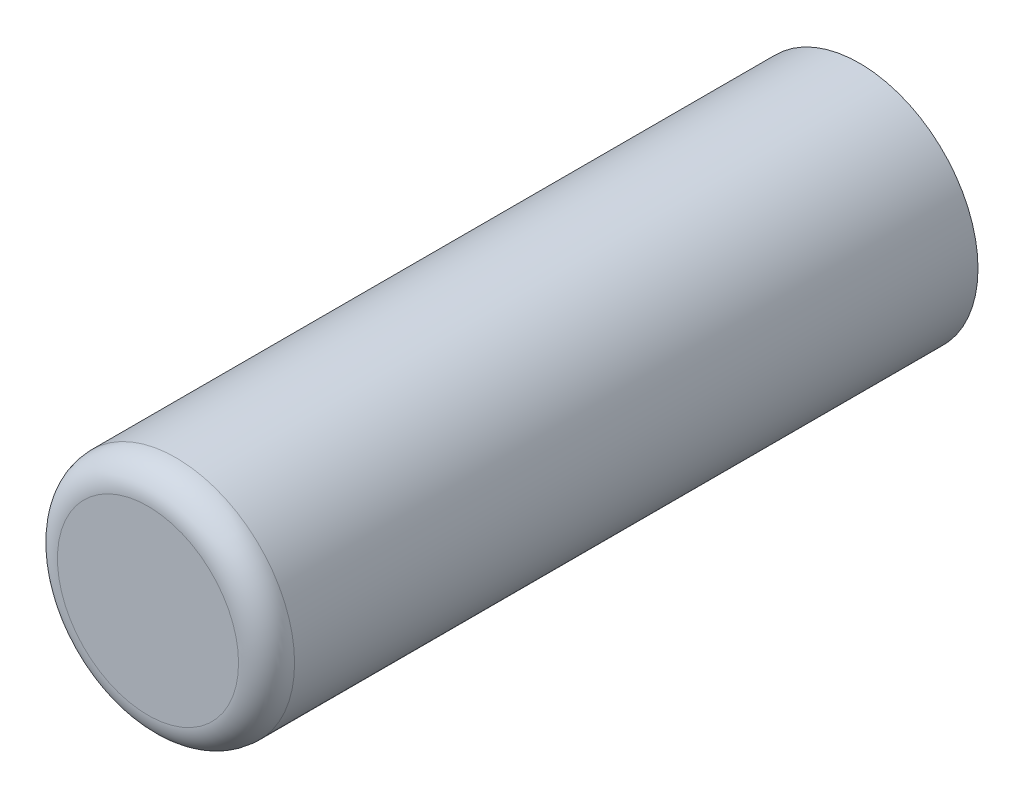
ISO-10303-21;
HEADER;
FILE_DESCRIPTION(('STEP AP214'),'2;1');
FILE_NAME('part.step','',(''),(''),'','','');
FILE_SCHEMA(('AUTOMOTIVE_DESIGN { 1 0 10303 214 1 1 1 1 }'));
ENDSEC;
DATA;
#1=APPLICATION_CONTEXT('core data for automotive mechanical design processes');
#2=APPLICATION_PROTOCOL_DEFINITION('international standard','automotive_design',2000,#1);
#3=PRODUCT_CONTEXT('',#1,'mechanical');
#4=PRODUCT('Part','Part','',(#3));
#5=PRODUCT_RELATED_PRODUCT_CATEGORY('part','',(#4));
#6=PRODUCT_DEFINITION_FORMATION('','',#4);
#7=PRODUCT_DEFINITION_CONTEXT('part definition',#1,'design');
#8=PRODUCT_DEFINITION('design','',#6,#7);
#9=PRODUCT_DEFINITION_SHAPE('','',#8);
#10=(LENGTH_UNIT() NAMED_UNIT(*) SI_UNIT(.MILLI.,.METRE.));
#11=(NAMED_UNIT(*) PLANE_ANGLE_UNIT() SI_UNIT($,.RADIAN.));
#12=(NAMED_UNIT(*) SI_UNIT($,.STERADIAN.) SOLID_ANGLE_UNIT());
#13=UNCERTAINTY_MEASURE_WITH_UNIT(LENGTH_MEASURE(1.E-05),#10,'distance_accuracy_value','');
#14=(GEOMETRIC_REPRESENTATION_CONTEXT(3) GLOBAL_UNCERTAINTY_ASSIGNED_CONTEXT((#13)) GLOBAL_UNIT_ASSIGNED_CONTEXT((#10,
#11,#12)) REPRESENTATION_CONTEXT('',''));
#15=CARTESIAN_POINT('',(0.,0.,0.));
#16=DIRECTION('',(0.,0.,1.));
#17=DIRECTION('',(1.,0.,0.));
#18=AXIS2_PLACEMENT_3D('',#15,#16,#17);
#19=CARTESIAN_POINT('',(0.,0.,76.2));
#20=DIRECTION('',(0.,0.,-1.));
#21=DIRECTION('',(-1.,0.,0.));
#22=AXIS2_PLACEMENT_3D('',#19,#20,#21);
#23=CYLINDRICAL_SURFACE('',#22,12.7);
#24=CARTESIAN_POINT('',(0.,0.,73.2));
#25=DIRECTION('',(0.,0.,1.));
#26=DIRECTION('',(1.,0.,0.));
#27=AXIS2_PLACEMENT_3D('',#24,#25,#26);
#28=CIRCLE('',#27,12.7);
#29=CARTESIAN_POINT('',(12.7,0.,73.2));
#30=VERTEX_POINT('',#29);
#31=EDGE_CURVE('E10',#30,#30,#28,.F.);
#32=ORIENTED_EDGE('',*,*,#31,.T.);
#33=EDGE_LOOP('',(#32));
#34=FACE_BOUND('',#33,.T.);
#35=CARTESIAN_POINT('',(0.,0.,0.));
#36=DIRECTION('',(0.,0.,1.));
#37=DIRECTION('',(1.,0.,0.));
#38=AXIS2_PLACEMENT_3D('',#35,#36,#37);
#39=CIRCLE('',#38,12.7);
#40=CARTESIAN_POINT('',(12.7,0.,0.));
#41=VERTEX_POINT('',#40);
#42=EDGE_CURVE('E42',#41,#41,#39,.T.);
#43=ORIENTED_EDGE('',*,*,#42,.T.);
#44=EDGE_LOOP('',(#43));
#45=FACE_BOUND('',#44,.T.);
#46=ADVANCED_FACE('F31',(#34,#45),#23,.T.);
#47=CARTESIAN_POINT('',(0.,0.,76.2));
#48=DIRECTION('',(0.,0.,1.));
#49=DIRECTION('',(1.,0.,0.));
#50=AXIS2_PLACEMENT_3D('',#47,#48,#49);
#51=PLANE('',#50);
#52=CARTESIAN_POINT('',(0.,0.,76.2));
#53=DIRECTION('',(0.,0.,1.));
#54=DIRECTION('',(1.,0.,0.));
#55=AXIS2_PLACEMENT_3D('',#52,#53,#54);
#56=CIRCLE('',#55,9.7);
#57=CARTESIAN_POINT('',(9.7,0.,76.2));
#58=VERTEX_POINT('',#57);
#59=EDGE_CURVE('E38',#58,#58,#56,.T.);
#60=ORIENTED_EDGE('',*,*,#59,.T.);
#61=EDGE_LOOP('',(#60));
#62=FACE_BOUND('',#61,.T.);
#63=ADVANCED_FACE('F52',(#62),#51,.T.);
#64=CARTESIAN_POINT('',(0.,0.,0.));
#65=DIRECTION('',(0.,0.,1.));
#66=DIRECTION('',(1.,0.,0.));
#67=AXIS2_PLACEMENT_3D('',#64,#65,#66);
#68=PLANE('',#67);
#69=ORIENTED_EDGE('',*,*,#42,.F.);
#70=EDGE_LOOP('',(#69));
#71=FACE_BOUND('',#70,.T.);
#72=ADVANCED_FACE('F50',(#71),#68,.F.);
#73=CARTESIAN_POINT('',(0.,0.,73.2));
#74=DIRECTION('',(0.,0.,1.));
#75=DIRECTION('',(1.,0.,0.));
#76=AXIS2_PLACEMENT_3D('',#73,#74,#75);
#77=TOROIDAL_SURFACE('',#76,9.7,3.);
#78=ORIENTED_EDGE('',*,*,#31,.F.);
#79=EDGE_LOOP('',(#78));
#80=FACE_BOUND('',#79,.T.);
#81=ORIENTED_EDGE('',*,*,#59,.F.);
#82=EDGE_LOOP('',(#81));
#83=FACE_BOUND('',#82,.T.);
#84=ADVANCED_FACE('F33',(#80,#83),#77,.T.);
#85=CLOSED_SHELL('',(#46,#63,#72,#84));
#86=MANIFOLD_SOLID_BREP('B2',#85);
#87=ADVANCED_BREP_SHAPE_REPRESENTATION('',(#18,#86),#14);
#88=SHAPE_DEFINITION_REPRESENTATION(#9,#87);
ENDSEC;
END-ISO-10303-21;
